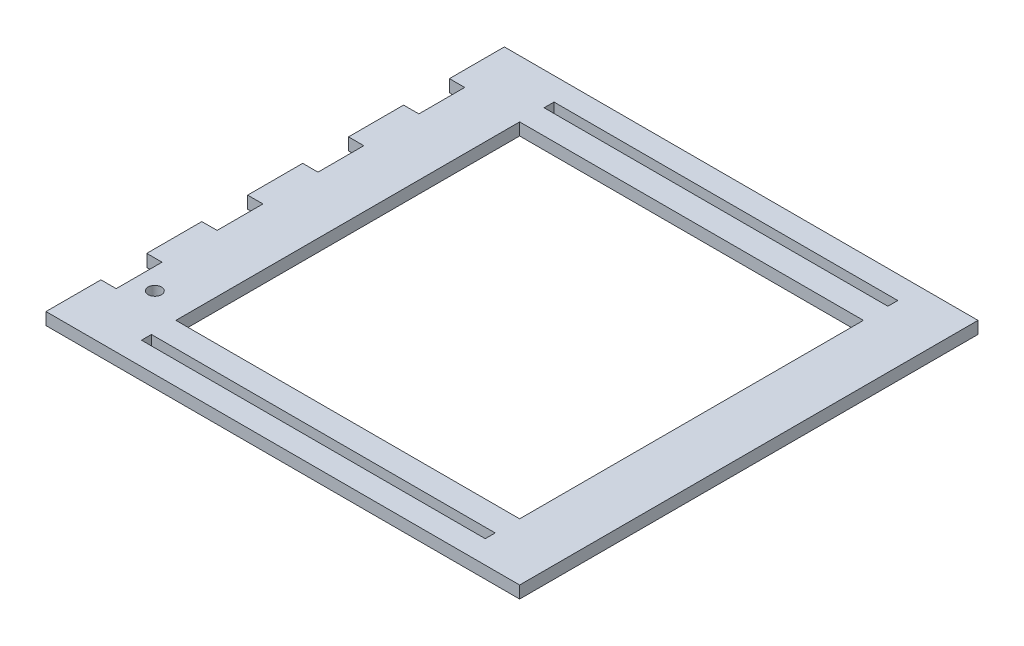
ISO-10303-21;
HEADER;
FILE_DESCRIPTION(('STEP AP214'),'2;1');
FILE_NAME('part.step','',(''),(''),'','','');
FILE_SCHEMA(('AUTOMOTIVE_DESIGN { 1 0 10303 214 1 1 1 1 }'));
ENDSEC;
DATA;
#1=APPLICATION_CONTEXT('core data for automotive mechanical design processes');
#2=APPLICATION_PROTOCOL_DEFINITION('international standard','automotive_design',2000,#1);
#3=PRODUCT_CONTEXT('',#1,'mechanical');
#4=PRODUCT('Part','Part','',(#3));
#5=PRODUCT_RELATED_PRODUCT_CATEGORY('part','',(#4));
#6=PRODUCT_DEFINITION_FORMATION('','',#4);
#7=PRODUCT_DEFINITION_CONTEXT('part definition',#1,'design');
#8=PRODUCT_DEFINITION('design','',#6,#7);
#9=PRODUCT_DEFINITION_SHAPE('','',#8);
#10=(LENGTH_UNIT() NAMED_UNIT(*) SI_UNIT(.MILLI.,.METRE.));
#11=(NAMED_UNIT(*) PLANE_ANGLE_UNIT() SI_UNIT($,.RADIAN.));
#12=(NAMED_UNIT(*) SI_UNIT($,.STERADIAN.) SOLID_ANGLE_UNIT());
#13=UNCERTAINTY_MEASURE_WITH_UNIT(LENGTH_MEASURE(1.E-05),#10,'distance_accuracy_value','');
#14=(GEOMETRIC_REPRESENTATION_CONTEXT(3) GLOBAL_UNCERTAINTY_ASSIGNED_CONTEXT((#13)) GLOBAL_UNIT_ASSIGNED_CONTEXT((#10,
#11,#12)) REPRESENTATION_CONTEXT('',''));
#15=CARTESIAN_POINT('',(0.,0.,0.));
#16=DIRECTION('',(0.,0.,1.));
#17=DIRECTION('',(1.,0.,0.));
#18=AXIS2_PLACEMENT_3D('',#15,#16,#17);
#19=CARTESIAN_POINT('',(-381.,4.064,-76.2));
#20=DIRECTION('',(0.,0.,1.));
#21=DIRECTION('',(1.,0.,0.));
#22=AXIS2_PLACEMENT_3D('',#19,#20,#21);
#23=PLANE('',#22);
#24=DIRECTION('',(-1.,0.,0.));
#25=VECTOR('',#24,1.);
#26=CARTESIAN_POINT('',(76.2,4.064,-76.1999999999999));
#27=LINE('',#26,#25);
#28=CARTESIAN_POINT('',(-228.6,4.064,-76.2));
#29=VERTEX_POINT('',#28);
#30=CARTESIAN_POINT('',(-386.08,4.064,-76.2));
#31=VERTEX_POINT('',#30);
#32=EDGE_CURVE('E251',#29,#31,#27,.T.);
#33=ORIENTED_EDGE('',*,*,#32,.F.);
#34=DIRECTION('',(0.,-1.,0.));
#35=VECTOR('',#34,1.);
#36=CARTESIAN_POINT('',(-228.6,4.064,-76.2));
#37=LINE('',#36,#35);
#38=CARTESIAN_POINT('',(-228.6,0.,-76.2));
#39=VERTEX_POINT('',#38);
#40=EDGE_CURVE('E239',#29,#39,#37,.T.);
#41=ORIENTED_EDGE('',*,*,#40,.T.);
#42=DIRECTION('',(-1.,0.,0.));
#43=VECTOR('',#42,1.);
#44=CARTESIAN_POINT('',(-381.,0.,-76.2));
#45=LINE('',#44,#43);
#46=CARTESIAN_POINT('',(-386.08,0.,-76.2));
#47=VERTEX_POINT('',#46);
#48=EDGE_CURVE('E298',#39,#47,#45,.T.);
#49=ORIENTED_EDGE('',*,*,#48,.T.);
#50=DIRECTION('',(0.,-1.,0.));
#51=VECTOR('',#50,1.);
#52=CARTESIAN_POINT('',(-386.08,4.064,-76.2));
#53=LINE('',#52,#51);
#54=EDGE_CURVE('E41',#31,#47,#53,.T.);
#55=ORIENTED_EDGE('',*,*,#54,.F.);
#56=EDGE_LOOP('',(#33,#41,#49,#55));
#57=FACE_BOUND('',#56,.T.);
#58=ADVANCED_FACE('F34',(#57),#23,.F.);
#59=CARTESIAN_POINT('',(-386.08,4.064,-76.2));
#60=DIRECTION('',(1.,0.,0.));
#61=DIRECTION('',(0.,0.,-1.));
#62=AXIS2_PLACEMENT_3D('',#59,#60,#61);
#63=PLANE('',#62);
#64=DIRECTION('',(0.,0.,1.));
#65=VECTOR('',#64,1.);
#66=CARTESIAN_POINT('',(-386.08,0.,-76.2));
#67=LINE('',#66,#65);
#68=CARTESIAN_POINT('',(-386.08,0.,-57.9375000000001));
#69=VERTEX_POINT('',#68);
#70=EDGE_CURVE('E300',#47,#69,#67,.T.);
#71=ORIENTED_EDGE('',*,*,#70,.T.);
#72=DIRECTION('',(0.,-1.,0.));
#73=VECTOR('',#72,1.);
#74=CARTESIAN_POINT('',(-386.08,4.064,-57.9375000000001));
#75=LINE('',#74,#73);
#76=CARTESIAN_POINT('',(-386.08,4.064,-57.9375000000001));
#77=VERTEX_POINT('',#76);
#78=EDGE_CURVE('E385',#77,#69,#75,.T.);
#79=ORIENTED_EDGE('',*,*,#78,.F.);
#80=DIRECTION('',(0.,0.,1.));
#81=VECTOR('',#80,1.);
#82=CARTESIAN_POINT('',(-386.08,4.064,-76.2));
#83=LINE('',#82,#81);
#84=EDGE_CURVE('E258',#31,#77,#83,.T.);
#85=ORIENTED_EDGE('',*,*,#84,.F.);
#86=ORIENTED_EDGE('',*,*,#54,.T.);
#87=EDGE_LOOP('',(#71,#79,#85,#86));
#88=FACE_BOUND('',#87,.T.);
#89=ADVANCED_FACE('F389',(#88),#63,.F.);
#90=CARTESIAN_POINT('',(-386.08,4.064,-57.9375000000001));
#91=DIRECTION('',(0.,0.,-1.));
#92=DIRECTION('',(-1.,0.,0.));
#93=AXIS2_PLACEMENT_3D('',#90,#91,#92);
#94=PLANE('',#93);
#95=DIRECTION('',(1.,0.,0.));
#96=VECTOR('',#95,1.);
#97=CARTESIAN_POINT('',(-386.08,0.,-57.9375000000001));
#98=LINE('',#97,#96);
#99=CARTESIAN_POINT('',(-381.,0.,-57.9375000000001));
#100=VERTEX_POINT('',#99);
#101=EDGE_CURVE('E303',#69,#100,#98,.T.);
#102=ORIENTED_EDGE('',*,*,#101,.T.);
#103=DIRECTION('',(0.,-1.,0.));
#104=VECTOR('',#103,1.);
#105=CARTESIAN_POINT('',(-381.,4.064,-57.9375000000001));
#106=LINE('',#105,#104);
#107=CARTESIAN_POINT('',(-381.,4.064,-57.9375000000001));
#108=VERTEX_POINT('',#107);
#109=EDGE_CURVE('E382',#108,#100,#106,.T.);
#110=ORIENTED_EDGE('',*,*,#109,.F.);
#111=DIRECTION('',(1.,0.,0.));
#112=VECTOR('',#111,1.);
#113=CARTESIAN_POINT('',(-386.08,4.064,-57.9375000000001));
#114=LINE('',#113,#112);
#115=EDGE_CURVE('E260',#77,#108,#114,.T.);
#116=ORIENTED_EDGE('',*,*,#115,.F.);
#117=ORIENTED_EDGE('',*,*,#78,.T.);
#118=EDGE_LOOP('',(#102,#110,#116,#117));
#119=FACE_BOUND('',#118,.T.);
#120=ADVANCED_FACE('F398',(#119),#94,.F.);
#121=CARTESIAN_POINT('',(-381.,4.064,-57.9375000000001));
#122=DIRECTION('',(1.,0.,0.));
#123=DIRECTION('',(0.,0.,-1.));
#124=AXIS2_PLACEMENT_3D('',#121,#122,#123);
#125=PLANE('',#124);
#126=DIRECTION('',(0.,0.,1.));
#127=VECTOR('',#126,1.);
#128=CARTESIAN_POINT('',(-381.,0.,-57.9375000000001));
#129=LINE('',#128,#127);
#130=CARTESIAN_POINT('',(-381.,0.,-42.6975000000001));
#131=VERTEX_POINT('',#130);
#132=EDGE_CURVE('E305',#100,#131,#129,.T.);
#133=ORIENTED_EDGE('',*,*,#132,.T.);
#134=DIRECTION('',(0.,-1.,0.));
#135=VECTOR('',#134,1.);
#136=CARTESIAN_POINT('',(-381.,4.064,-42.6975000000001));
#137=LINE('',#136,#135);
#138=CARTESIAN_POINT('',(-381.,4.064,-42.6975000000001));
#139=VERTEX_POINT('',#138);
#140=EDGE_CURVE('E379',#139,#131,#137,.T.);
#141=ORIENTED_EDGE('',*,*,#140,.F.);
#142=DIRECTION('',(0.,0.,1.));
#143=VECTOR('',#142,1.);
#144=CARTESIAN_POINT('',(-381.,4.064,-57.9375000000001));
#145=LINE('',#144,#143);
#146=EDGE_CURVE('E267',#108,#139,#145,.T.);
#147=ORIENTED_EDGE('',*,*,#146,.F.);
#148=ORIENTED_EDGE('',*,*,#109,.T.);
#149=EDGE_LOOP('',(#133,#141,#147,#148));
#150=FACE_BOUND('',#149,.T.);
#151=ADVANCED_FACE('F402',(#150),#125,.F.);
#152=CARTESIAN_POINT('',(-381.,4.064,-42.6975000000001));
#153=DIRECTION('',(0.,0.,1.));
#154=DIRECTION('',(1.,0.,0.));
#155=AXIS2_PLACEMENT_3D('',#152,#153,#154);
#156=PLANE('',#155);
#157=DIRECTION('',(-1.,0.,0.));
#158=VECTOR('',#157,1.);
#159=CARTESIAN_POINT('',(-381.,0.,-42.6975000000001));
#160=LINE('',#159,#158);
#161=CARTESIAN_POINT('',(-386.08,0.,-42.6975000000001));
#162=VERTEX_POINT('',#161);
#163=EDGE_CURVE('E307',#131,#162,#160,.T.);
#164=ORIENTED_EDGE('',*,*,#163,.T.);
#165=DIRECTION('',(0.,-1.,0.));
#166=VECTOR('',#165,1.);
#167=CARTESIAN_POINT('',(-386.08,4.064,-42.6975000000001));
#168=LINE('',#167,#166);
#169=CARTESIAN_POINT('',(-386.08,4.064,-42.6975000000001));
#170=VERTEX_POINT('',#169);
#171=EDGE_CURVE('E376',#170,#162,#168,.T.);
#172=ORIENTED_EDGE('',*,*,#171,.F.);
#173=DIRECTION('',(-1.,0.,0.));
#174=VECTOR('',#173,1.);
#175=CARTESIAN_POINT('',(-381.,4.064,-42.6975000000001));
#176=LINE('',#175,#174);
#177=EDGE_CURVE('E269',#139,#170,#176,.T.);
#178=ORIENTED_EDGE('',*,*,#177,.F.);
#179=ORIENTED_EDGE('',*,*,#140,.T.);
#180=EDGE_LOOP('',(#164,#172,#178,#179));
#181=FACE_BOUND('',#180,.T.);
#182=ADVANCED_FACE('F409',(#181),#156,.F.);
#183=CARTESIAN_POINT('',(-386.08,4.064,-42.6975000000001));
#184=DIRECTION('',(1.,0.,0.));
#185=DIRECTION('',(0.,0.,-1.));
#186=AXIS2_PLACEMENT_3D('',#183,#184,#185);
#187=PLANE('',#186);
#188=DIRECTION('',(0.,0.,1.));
#189=VECTOR('',#188,1.);
#190=CARTESIAN_POINT('',(-386.08,0.,-42.6975000000001));
#191=LINE('',#190,#189);
#192=CARTESIAN_POINT('',(-386.08,0.,-24.3925000000001));
#193=VERTEX_POINT('',#192);
#194=EDGE_CURVE('E309',#162,#193,#191,.T.);
#195=ORIENTED_EDGE('',*,*,#194,.T.);
#196=DIRECTION('',(0.,-1.,0.));
#197=VECTOR('',#196,1.);
#198=CARTESIAN_POINT('',(-386.08,4.064,-24.3925000000001));
#199=LINE('',#198,#197);
#200=CARTESIAN_POINT('',(-386.08,4.064,-24.3925000000001));
#201=VERTEX_POINT('',#200);
#202=EDGE_CURVE('E373',#201,#193,#199,.T.);
#203=ORIENTED_EDGE('',*,*,#202,.F.);
#204=DIRECTION('',(0.,0.,1.));
#205=VECTOR('',#204,1.);
#206=CARTESIAN_POINT('',(-386.08,4.064,-42.6975000000001));
#207=LINE('',#206,#205);
#208=EDGE_CURVE('E271',#170,#201,#207,.T.);
#209=ORIENTED_EDGE('',*,*,#208,.F.);
#210=ORIENTED_EDGE('',*,*,#171,.T.);
#211=EDGE_LOOP('',(#195,#203,#209,#210));
#212=FACE_BOUND('',#211,.T.);
#213=ADVANCED_FACE('F412',(#212),#187,.F.);
#214=CARTESIAN_POINT('',(-386.08,4.064,-24.3925000000001));
#215=DIRECTION('',(0.,0.,-1.));
#216=DIRECTION('',(-1.,0.,0.));
#217=AXIS2_PLACEMENT_3D('',#214,#215,#216);
#218=PLANE('',#217);
#219=DIRECTION('',(1.,0.,0.));
#220=VECTOR('',#219,1.);
#221=CARTESIAN_POINT('',(-386.08,0.,-24.3925000000001));
#222=LINE('',#221,#220);
#223=CARTESIAN_POINT('',(-381.,0.,-24.3925000000001));
#224=VERTEX_POINT('',#223);
#225=EDGE_CURVE('E311',#193,#224,#222,.T.);
#226=ORIENTED_EDGE('',*,*,#225,.T.);
#227=DIRECTION('',(0.,-1.,0.));
#228=VECTOR('',#227,1.);
#229=CARTESIAN_POINT('',(-381.,4.064,-24.3925000000001));
#230=LINE('',#229,#228);
#231=CARTESIAN_POINT('',(-381.,4.064,-24.3925000000001));
#232=VERTEX_POINT('',#231);
#233=EDGE_CURVE('E370',#232,#224,#230,.T.);
#234=ORIENTED_EDGE('',*,*,#233,.F.);
#235=DIRECTION('',(1.,0.,0.));
#236=VECTOR('',#235,1.);
#237=CARTESIAN_POINT('',(-386.08,4.064,-24.3925000000001));
#238=LINE('',#237,#236);
#239=EDGE_CURVE('E273',#201,#232,#238,.T.);
#240=ORIENTED_EDGE('',*,*,#239,.F.);
#241=ORIENTED_EDGE('',*,*,#202,.T.);
#242=EDGE_LOOP('',(#226,#234,#240,#241));
#243=FACE_BOUND('',#242,.T.);
#244=ADVANCED_FACE('F417',(#243),#218,.F.);
#245=CARTESIAN_POINT('',(-381.,4.064,-24.3925000000001));
#246=DIRECTION('',(1.,0.,0.));
#247=DIRECTION('',(0.,0.,-1.));
#248=AXIS2_PLACEMENT_3D('',#245,#246,#247);
#249=PLANE('',#248);
#250=DIRECTION('',(0.,0.,1.));
#251=VECTOR('',#250,1.);
#252=CARTESIAN_POINT('',(-381.,0.,-24.3925000000001));
#253=LINE('',#252,#251);
#254=CARTESIAN_POINT('',(-381.,0.,-9.15250000000007));
#255=VERTEX_POINT('',#254);
#256=EDGE_CURVE('E313',#224,#255,#253,.T.);
#257=ORIENTED_EDGE('',*,*,#256,.T.);
#258=DIRECTION('',(0.,-1.,0.));
#259=VECTOR('',#258,1.);
#260=CARTESIAN_POINT('',(-381.,4.064,-9.15250000000007));
#261=LINE('',#260,#259);
#262=CARTESIAN_POINT('',(-381.,4.064,-9.15250000000007));
#263=VERTEX_POINT('',#262);
#264=EDGE_CURVE('E367',#263,#255,#261,.T.);
#265=ORIENTED_EDGE('',*,*,#264,.F.);
#266=DIRECTION('',(0.,0.,1.));
#267=VECTOR('',#266,1.);
#268=CARTESIAN_POINT('',(-381.,4.064,-24.3925000000001));
#269=LINE('',#268,#267);
#270=EDGE_CURVE('E275',#232,#263,#269,.T.);
#271=ORIENTED_EDGE('',*,*,#270,.F.);
#272=ORIENTED_EDGE('',*,*,#233,.T.);
#273=EDGE_LOOP('',(#257,#265,#271,#272));
#274=FACE_BOUND('',#273,.T.);
#275=ADVANCED_FACE('F423',(#274),#249,.F.);
#276=CARTESIAN_POINT('',(-381.,4.064,-9.15250000000007));
#277=DIRECTION('',(0.,0.,1.));
#278=DIRECTION('',(1.,0.,0.));
#279=AXIS2_PLACEMENT_3D('',#276,#277,#278);
#280=PLANE('',#279);
#281=DIRECTION('',(-1.,0.,0.));
#282=VECTOR('',#281,1.);
#283=CARTESIAN_POINT('',(-381.,0.,-9.15250000000007));
#284=LINE('',#283,#282);
#285=CARTESIAN_POINT('',(-386.08,0.,-9.15250000000007));
#286=VERTEX_POINT('',#285);
#287=EDGE_CURVE('E315',#255,#286,#284,.T.);
#288=ORIENTED_EDGE('',*,*,#287,.T.);
#289=DIRECTION('',(0.,-1.,0.));
#290=VECTOR('',#289,1.);
#291=CARTESIAN_POINT('',(-386.08,4.064,-9.15250000000007));
#292=LINE('',#291,#290);
#293=CARTESIAN_POINT('',(-386.08,4.064,-9.15250000000007));
#294=VERTEX_POINT('',#293);
#295=EDGE_CURVE('E364',#294,#286,#292,.T.);
#296=ORIENTED_EDGE('',*,*,#295,.F.);
#297=DIRECTION('',(-1.,0.,0.));
#298=VECTOR('',#297,1.);
#299=CARTESIAN_POINT('',(-381.,4.064,-9.15250000000007));
#300=LINE('',#299,#298);
#301=EDGE_CURVE('E277',#263,#294,#300,.T.);
#302=ORIENTED_EDGE('',*,*,#301,.F.);
#303=ORIENTED_EDGE('',*,*,#264,.T.);
#304=EDGE_LOOP('',(#288,#296,#302,#303));
#305=FACE_BOUND('',#304,.T.);
#306=ADVANCED_FACE('F427',(#305),#280,.F.);
#307=CARTESIAN_POINT('',(-386.08,4.064,-9.15250000000007));
#308=DIRECTION('',(1.,0.,0.));
#309=DIRECTION('',(0.,0.,-1.));
#310=AXIS2_PLACEMENT_3D('',#307,#308,#309);
#311=PLANE('',#310);
#312=DIRECTION('',(0.,0.,1.));
#313=VECTOR('',#312,1.);
#314=CARTESIAN_POINT('',(-386.08,0.,-9.15250000000007));
#315=LINE('',#314,#313);
#316=CARTESIAN_POINT('',(-386.08,0.,9.15249999999993));
#317=VERTEX_POINT('',#316);
#318=EDGE_CURVE('E317',#286,#317,#315,.T.);
#319=ORIENTED_EDGE('',*,*,#318,.T.);
#320=DIRECTION('',(0.,-1.,0.));
#321=VECTOR('',#320,1.);
#322=CARTESIAN_POINT('',(-386.08,4.064,9.15249999999993));
#323=LINE('',#322,#321);
#324=CARTESIAN_POINT('',(-386.08,4.064,9.15249999999993));
#325=VERTEX_POINT('',#324);
#326=EDGE_CURVE('E361',#325,#317,#323,.T.);
#327=ORIENTED_EDGE('',*,*,#326,.F.);
#328=DIRECTION('',(0.,0.,1.));
#329=VECTOR('',#328,1.);
#330=CARTESIAN_POINT('',(-386.08,4.064,-9.15250000000007));
#331=LINE('',#330,#329);
#332=EDGE_CURVE('E279',#294,#325,#331,.T.);
#333=ORIENTED_EDGE('',*,*,#332,.F.);
#334=ORIENTED_EDGE('',*,*,#295,.T.);
#335=EDGE_LOOP('',(#319,#327,#333,#334));
#336=FACE_BOUND('',#335,.T.);
#337=ADVANCED_FACE('F432',(#336),#311,.F.);
#338=CARTESIAN_POINT('',(-386.08,4.064,9.15249999999993));
#339=DIRECTION('',(0.,0.,-1.));
#340=DIRECTION('',(-1.,0.,0.));
#341=AXIS2_PLACEMENT_3D('',#338,#339,#340);
#342=PLANE('',#341);
#343=DIRECTION('',(1.,0.,0.));
#344=VECTOR('',#343,1.);
#345=CARTESIAN_POINT('',(-386.08,0.,9.15249999999993));
#346=LINE('',#345,#344);
#347=CARTESIAN_POINT('',(-381.,0.,9.15249999999993));
#348=VERTEX_POINT('',#347);
#349=EDGE_CURVE('E319',#317,#348,#346,.T.);
#350=ORIENTED_EDGE('',*,*,#349,.T.);
#351=DIRECTION('',(0.,-1.,0.));
#352=VECTOR('',#351,1.);
#353=CARTESIAN_POINT('',(-381.,4.064,9.15249999999993));
#354=LINE('',#353,#352);
#355=CARTESIAN_POINT('',(-381.,4.064,9.15249999999993));
#356=VERTEX_POINT('',#355);
#357=EDGE_CURVE('E358',#356,#348,#354,.T.);
#358=ORIENTED_EDGE('',*,*,#357,.F.);
#359=DIRECTION('',(1.,0.,0.));
#360=VECTOR('',#359,1.);
#361=CARTESIAN_POINT('',(-386.08,4.064,9.15249999999993));
#362=LINE('',#361,#360);
#363=EDGE_CURVE('E281',#325,#356,#362,.T.);
#364=ORIENTED_EDGE('',*,*,#363,.F.);
#365=ORIENTED_EDGE('',*,*,#326,.T.);
#366=EDGE_LOOP('',(#350,#358,#364,#365));
#367=FACE_BOUND('',#366,.T.);
#368=ADVANCED_FACE('F438',(#367),#342,.F.);
#369=CARTESIAN_POINT('',(-381.,4.064,9.15249999999993));
#370=DIRECTION('',(1.,0.,0.));
#371=DIRECTION('',(0.,0.,-1.));
#372=AXIS2_PLACEMENT_3D('',#369,#370,#371);
#373=PLANE('',#372);
#374=DIRECTION('',(0.,0.,1.));
#375=VECTOR('',#374,1.);
#376=CARTESIAN_POINT('',(-381.,0.,9.15249999999993));
#377=LINE('',#376,#375);
#378=CARTESIAN_POINT('',(-381.,0.,24.3924999999999));
#379=VERTEX_POINT('',#378);
#380=EDGE_CURVE('E321',#348,#379,#377,.T.);
#381=ORIENTED_EDGE('',*,*,#380,.T.);
#382=DIRECTION('',(0.,-1.,0.));
#383=VECTOR('',#382,1.);
#384=CARTESIAN_POINT('',(-381.,4.064,24.3924999999999));
#385=LINE('',#384,#383);
#386=CARTESIAN_POINT('',(-381.,4.064,24.3924999999999));
#387=VERTEX_POINT('',#386);
#388=EDGE_CURVE('E355',#387,#379,#385,.T.);
#389=ORIENTED_EDGE('',*,*,#388,.F.);
#390=DIRECTION('',(0.,0.,1.));
#391=VECTOR('',#390,1.);
#392=CARTESIAN_POINT('',(-381.,4.064,9.15249999999993));
#393=LINE('',#392,#391);
#394=EDGE_CURVE('E283',#356,#387,#393,.T.);
#395=ORIENTED_EDGE('',*,*,#394,.F.);
#396=ORIENTED_EDGE('',*,*,#357,.T.);
#397=EDGE_LOOP('',(#381,#389,#395,#396));
#398=FACE_BOUND('',#397,.T.);
#399=ADVANCED_FACE('F442',(#398),#373,.F.);
#400=CARTESIAN_POINT('',(-381.,4.064,24.3924999999999));
#401=DIRECTION('',(0.,0.,1.));
#402=DIRECTION('',(1.,0.,0.));
#403=AXIS2_PLACEMENT_3D('',#400,#401,#402);
#404=PLANE('',#403);
#405=DIRECTION('',(-1.,0.,0.));
#406=VECTOR('',#405,1.);
#407=CARTESIAN_POINT('',(-381.,0.,24.3924999999999));
#408=LINE('',#407,#406);
#409=CARTESIAN_POINT('',(-386.08,0.,24.3924999999999));
#410=VERTEX_POINT('',#409);
#411=EDGE_CURVE('E323',#379,#410,#408,.T.);
#412=ORIENTED_EDGE('',*,*,#411,.T.);
#413=DIRECTION('',(0.,-1.,0.));
#414=VECTOR('',#413,1.);
#415=CARTESIAN_POINT('',(-386.08,4.064,24.3924999999999));
#416=LINE('',#415,#414);
#417=CARTESIAN_POINT('',(-386.08,4.064,24.3924999999999));
#418=VERTEX_POINT('',#417);
#419=EDGE_CURVE('E352',#418,#410,#416,.T.);
#420=ORIENTED_EDGE('',*,*,#419,.F.);
#421=DIRECTION('',(-1.,0.,0.));
#422=VECTOR('',#421,1.);
#423=CARTESIAN_POINT('',(-381.,4.064,24.3924999999999));
#424=LINE('',#423,#422);
#425=EDGE_CURVE('E285',#387,#418,#424,.T.);
#426=ORIENTED_EDGE('',*,*,#425,.F.);
#427=ORIENTED_EDGE('',*,*,#388,.T.);
#428=EDGE_LOOP('',(#412,#420,#426,#427));
#429=FACE_BOUND('',#428,.T.);
#430=ADVANCED_FACE('F447',(#429),#404,.F.);
#431=CARTESIAN_POINT('',(-386.08,4.064,24.3924999999999));
#432=DIRECTION('',(1.,0.,0.));
#433=DIRECTION('',(0.,0.,-1.));
#434=AXIS2_PLACEMENT_3D('',#431,#432,#433);
#435=PLANE('',#434);
#436=DIRECTION('',(0.,0.,1.));
#437=VECTOR('',#436,1.);
#438=CARTESIAN_POINT('',(-386.08,0.,24.3924999999999));
#439=LINE('',#438,#437);
#440=CARTESIAN_POINT('',(-386.08,0.,42.6974999999999));
#441=VERTEX_POINT('',#440);
#442=EDGE_CURVE('E325',#410,#441,#439,.T.);
#443=ORIENTED_EDGE('',*,*,#442,.T.);
#444=DIRECTION('',(0.,-1.,0.));
#445=VECTOR('',#444,1.);
#446=CARTESIAN_POINT('',(-386.08,4.064,42.6974999999999));
#447=LINE('',#446,#445);
#448=CARTESIAN_POINT('',(-386.08,4.064,42.6974999999999));
#449=VERTEX_POINT('',#448);
#450=EDGE_CURVE('E349',#449,#441,#447,.T.);
#451=ORIENTED_EDGE('',*,*,#450,.F.);
#452=DIRECTION('',(0.,0.,1.));
#453=VECTOR('',#452,1.);
#454=CARTESIAN_POINT('',(-386.08,4.064,24.3924999999999));
#455=LINE('',#454,#453);
#456=EDGE_CURVE('E287',#418,#449,#455,.T.);
#457=ORIENTED_EDGE('',*,*,#456,.F.);
#458=ORIENTED_EDGE('',*,*,#419,.T.);
#459=EDGE_LOOP('',(#443,#451,#457,#458));
#460=FACE_BOUND('',#459,.T.);
#461=ADVANCED_FACE('F453',(#460),#435,.F.);
#462=CARTESIAN_POINT('',(-386.08,4.064,42.6974999999999));
#463=DIRECTION('',(0.,0.,-1.));
#464=DIRECTION('',(-1.,0.,0.));
#465=AXIS2_PLACEMENT_3D('',#462,#463,#464);
#466=PLANE('',#465);
#467=DIRECTION('',(1.,0.,0.));
#468=VECTOR('',#467,1.);
#469=CARTESIAN_POINT('',(-386.08,0.,42.6974999999999));
#470=LINE('',#469,#468);
#471=CARTESIAN_POINT('',(-381.,0.,42.6974999999999));
#472=VERTEX_POINT('',#471);
#473=EDGE_CURVE('E327',#441,#472,#470,.T.);
#474=ORIENTED_EDGE('',*,*,#473,.T.);
#475=DIRECTION('',(0.,-1.,0.));
#476=VECTOR('',#475,1.);
#477=CARTESIAN_POINT('',(-381.,4.064,42.6974999999999));
#478=LINE('',#477,#476);
#479=CARTESIAN_POINT('',(-381.,4.064,42.6974999999999));
#480=VERTEX_POINT('',#479);
#481=EDGE_CURVE('E346',#480,#472,#478,.T.);
#482=ORIENTED_EDGE('',*,*,#481,.F.);
#483=DIRECTION('',(1.,0.,0.));
#484=VECTOR('',#483,1.);
#485=CARTESIAN_POINT('',(-386.08,4.064,42.6974999999999));
#486=LINE('',#485,#484);
#487=EDGE_CURVE('E289',#449,#480,#486,.T.);
#488=ORIENTED_EDGE('',*,*,#487,.F.);
#489=ORIENTED_EDGE('',*,*,#450,.T.);
#490=EDGE_LOOP('',(#474,#482,#488,#489));
#491=FACE_BOUND('',#490,.T.);
#492=ADVANCED_FACE('F457',(#491),#466,.F.);
#493=CARTESIAN_POINT('',(-381.,4.064,42.6974999999999));
#494=DIRECTION('',(1.,0.,0.));
#495=DIRECTION('',(0.,0.,-1.));
#496=AXIS2_PLACEMENT_3D('',#493,#494,#495);
#497=PLANE('',#496);
#498=DIRECTION('',(0.,0.,1.));
#499=VECTOR('',#498,1.);
#500=CARTESIAN_POINT('',(-381.,0.,42.6974999999999));
#501=LINE('',#500,#499);
#502=CARTESIAN_POINT('',(-381.,0.,57.9374999999999));
#503=VERTEX_POINT('',#502);
#504=EDGE_CURVE('E329',#472,#503,#501,.T.);
#505=ORIENTED_EDGE('',*,*,#504,.T.);
#506=DIRECTION('',(0.,-1.,0.));
#507=VECTOR('',#506,1.);
#508=CARTESIAN_POINT('',(-381.,4.064,57.9374999999999));
#509=LINE('',#508,#507);
#510=CARTESIAN_POINT('',(-381.,4.064,57.9374999999999));
#511=VERTEX_POINT('',#510);
#512=EDGE_CURVE('E343',#511,#503,#509,.T.);
#513=ORIENTED_EDGE('',*,*,#512,.F.);
#514=DIRECTION('',(0.,0.,1.));
#515=VECTOR('',#514,1.);
#516=CARTESIAN_POINT('',(-381.,4.064,42.6974999999999));
#517=LINE('',#516,#515);
#518=EDGE_CURVE('E291',#480,#511,#517,.T.);
#519=ORIENTED_EDGE('',*,*,#518,.F.);
#520=ORIENTED_EDGE('',*,*,#481,.T.);
#521=EDGE_LOOP('',(#505,#513,#519,#520));
#522=FACE_BOUND('',#521,.T.);
#523=ADVANCED_FACE('F462',(#522),#497,.F.);
#524=CARTESIAN_POINT('',(-381.,4.064,57.9374999999999));
#525=DIRECTION('',(0.,0.,1.));
#526=DIRECTION('',(1.,0.,0.));
#527=AXIS2_PLACEMENT_3D('',#524,#525,#526);
#528=PLANE('',#527);
#529=DIRECTION('',(-1.,0.,0.));
#530=VECTOR('',#529,1.);
#531=CARTESIAN_POINT('',(-381.,0.,57.9374999999999));
#532=LINE('',#531,#530);
#533=CARTESIAN_POINT('',(-386.08,0.,57.9374999999999));
#534=VERTEX_POINT('',#533);
#535=EDGE_CURVE('E331',#503,#534,#532,.T.);
#536=ORIENTED_EDGE('',*,*,#535,.T.);
#537=DIRECTION('',(0.,-1.,0.));
#538=VECTOR('',#537,1.);
#539=CARTESIAN_POINT('',(-386.08,4.064,57.9374999999999));
#540=LINE('',#539,#538);
#541=CARTESIAN_POINT('',(-386.08,4.064,57.9374999999999));
#542=VERTEX_POINT('',#541);
#543=EDGE_CURVE('E340',#542,#534,#540,.T.);
#544=ORIENTED_EDGE('',*,*,#543,.F.);
#545=DIRECTION('',(-1.,0.,0.));
#546=VECTOR('',#545,1.);
#547=CARTESIAN_POINT('',(-381.,4.064,57.9374999999999));
#548=LINE('',#547,#546);
#549=EDGE_CURVE('E293',#511,#542,#548,.T.);
#550=ORIENTED_EDGE('',*,*,#549,.F.);
#551=ORIENTED_EDGE('',*,*,#512,.T.);
#552=EDGE_LOOP('',(#536,#544,#550,#551));
#553=FACE_BOUND('',#552,.T.);
#554=ADVANCED_FACE('F468',(#553),#528,.F.);
#555=CARTESIAN_POINT('',(-386.08,4.064,57.9374999999999));
#556=DIRECTION('',(1.,0.,0.));
#557=DIRECTION('',(0.,0.,-1.));
#558=AXIS2_PLACEMENT_3D('',#555,#556,#557);
#559=PLANE('',#558);
#560=DIRECTION('',(0.,0.,1.));
#561=VECTOR('',#560,1.);
#562=CARTESIAN_POINT('',(-386.08,0.,57.9374999999999));
#563=LINE('',#562,#561);
#564=CARTESIAN_POINT('',(-386.08,0.,76.2));
#565=VERTEX_POINT('',#564);
#566=EDGE_CURVE('E333',#534,#565,#563,.T.);
#567=ORIENTED_EDGE('',*,*,#566,.T.);
#568=DIRECTION('',(0.,-1.,0.));
#569=VECTOR('',#568,1.);
#570=CARTESIAN_POINT('',(-386.08,4.064,76.2));
#571=LINE('',#570,#569);
#572=CARTESIAN_POINT('',(-386.08,4.064,76.2));
#573=VERTEX_POINT('',#572);
#574=EDGE_CURVE('E297',#573,#565,#571,.T.);
#575=ORIENTED_EDGE('',*,*,#574,.F.);
#576=DIRECTION('',(0.,0.,1.));
#577=VECTOR('',#576,1.);
#578=CARTESIAN_POINT('',(-386.08,4.064,57.9374999999999));
#579=LINE('',#578,#577);
#580=EDGE_CURVE('E295',#542,#573,#579,.T.);
#581=ORIENTED_EDGE('',*,*,#580,.F.);
#582=ORIENTED_EDGE('',*,*,#543,.T.);
#583=EDGE_LOOP('',(#567,#575,#581,#582));
#584=FACE_BOUND('',#583,.T.);
#585=ADVANCED_FACE('F472',(#584),#559,.F.);
#586=CARTESIAN_POINT('',(-76.2000000000001,4.064,76.2));
#587=DIRECTION('',(0.,0.,-1.));
#588=DIRECTION('',(-1.,0.,0.));
#589=AXIS2_PLACEMENT_3D('',#586,#587,#588);
#590=PLANE('',#589);
#591=DIRECTION('',(1.,0.,0.));
#592=VECTOR('',#591,1.);
#593=CARTESIAN_POINT('',(-76.2000000000001,0.,76.2));
#594=LINE('',#593,#592);
#595=CARTESIAN_POINT('',(-228.6,0.,76.2));
#596=VERTEX_POINT('',#595);
#597=EDGE_CURVE('E262',#565,#596,#594,.T.);
#598=ORIENTED_EDGE('',*,*,#597,.T.);
#599=DIRECTION('',(0.,-1.,0.));
#600=VECTOR('',#599,1.);
#601=CARTESIAN_POINT('',(-228.6,4.064,76.2));
#602=LINE('',#601,#600);
#603=CARTESIAN_POINT('',(-228.6,4.064,76.2));
#604=VERTEX_POINT('',#603);
#605=EDGE_CURVE('E48',#604,#596,#602,.T.);
#606=ORIENTED_EDGE('',*,*,#605,.F.);
#607=DIRECTION('',(1.,0.,0.));
#608=VECTOR('',#607,1.);
#609=CARTESIAN_POINT('',(76.1999999999999,4.064,76.2));
#610=LINE('',#609,#608);
#611=EDGE_CURVE('E254',#573,#604,#610,.T.);
#612=ORIENTED_EDGE('',*,*,#611,.F.);
#613=ORIENTED_EDGE('',*,*,#574,.T.);
#614=EDGE_LOOP('',(#598,#606,#612,#613));
#615=FACE_BOUND('',#614,.T.);
#616=ADVANCED_FACE('F474',(#615),#590,.F.);
#617=CARTESIAN_POINT('',(0.,4.064,0.));
#618=DIRECTION('',(0.,1.,0.));
#619=DIRECTION('',(0.,0.,1.));
#620=AXIS2_PLACEMENT_3D('',#617,#618,#619);
#621=PLANE('',#620);
#622=DIRECTION('',(0.,0.,-1.));
#623=VECTOR('',#622,1.);
#624=CARTESIAN_POINT('',(-228.6,4.064,-76.2));
#625=LINE('',#624,#623);
#626=EDGE_CURVE('E242',#604,#29,#625,.T.);
#627=ORIENTED_EDGE('',*,*,#626,.T.);
#628=ORIENTED_EDGE('',*,*,#32,.T.);
#629=ORIENTED_EDGE('',*,*,#84,.T.);
#630=ORIENTED_EDGE('',*,*,#115,.T.);
#631=ORIENTED_EDGE('',*,*,#146,.T.);
#632=ORIENTED_EDGE('',*,*,#177,.T.);
#633=ORIENTED_EDGE('',*,*,#208,.T.);
#634=ORIENTED_EDGE('',*,*,#239,.T.);
#635=ORIENTED_EDGE('',*,*,#270,.T.);
#636=ORIENTED_EDGE('',*,*,#301,.T.);
#637=ORIENTED_EDGE('',*,*,#332,.T.);
#638=ORIENTED_EDGE('',*,*,#363,.T.);
#639=ORIENTED_EDGE('',*,*,#394,.T.);
#640=ORIENTED_EDGE('',*,*,#425,.T.);
#641=ORIENTED_EDGE('',*,*,#456,.T.);
#642=ORIENTED_EDGE('',*,*,#487,.T.);
#643=ORIENTED_EDGE('',*,*,#518,.T.);
#644=ORIENTED_EDGE('',*,*,#549,.T.);
#645=ORIENTED_EDGE('',*,*,#580,.T.);
#646=ORIENTED_EDGE('',*,*,#611,.T.);
#647=EDGE_LOOP('',(#627,#628,#629,#630,#631,#632,#633,#634,#635,#636,#637,#638,#639,#640,#641,
#642,#643,#644,#645,#646));
#648=FACE_BOUND('',#647,.T.);
#649=DIRECTION('',(0.,0.,1.));
#650=VECTOR('',#649,1.);
#651=CARTESIAN_POINT('',(-361.95,4.064,-65.278));
#652=LINE('',#651,#650);
#653=CARTESIAN_POINT('',(-361.95,4.064,-68.58));
#654=VERTEX_POINT('',#653);
#655=CARTESIAN_POINT('',(-361.95,4.064,-65.278));
#656=VERTEX_POINT('',#655);
#657=EDGE_CURVE('E55',#654,#656,#652,.T.);
#658=ORIENTED_EDGE('',*,*,#657,.F.);
#659=DIRECTION('',(-1.,0.,0.));
#660=VECTOR('',#659,1.);
#661=CARTESIAN_POINT('',(-361.95,4.064,-68.58));
#662=LINE('',#661,#660);
#663=CARTESIAN_POINT('',(-247.65,4.064,-68.58));
#664=VERTEX_POINT('',#663);
#665=EDGE_CURVE('E519',#664,#654,#662,.T.);
#666=ORIENTED_EDGE('',*,*,#665,.F.);
#667=DIRECTION('',(0.,0.,-1.));
#668=VECTOR('',#667,1.);
#669=CARTESIAN_POINT('',(-247.65,4.064,-65.278));
#670=LINE('',#669,#668);
#671=CARTESIAN_POINT('',(-247.65,4.064,-65.278));
#672=VERTEX_POINT('',#671);
#673=EDGE_CURVE('E533',#672,#664,#670,.T.);
#674=ORIENTED_EDGE('',*,*,#673,.F.);
#675=DIRECTION('',(1.,0.,0.));
#676=VECTOR('',#675,1.);
#677=CARTESIAN_POINT('',(-361.95,4.064,-65.278));
#678=LINE('',#677,#676);
#679=EDGE_CURVE('E530',#656,#672,#678,.T.);
#680=ORIENTED_EDGE('',*,*,#679,.F.);
#681=EDGE_LOOP('',(#658,#666,#674,#680));
#682=FACE_BOUND('',#681,.T.);
#683=CARTESIAN_POINT('',(-373.95,4.064,52.15));
#684=DIRECTION('',(0.,1.,0.));
#685=DIRECTION('',(0.,0.,1.));
#686=AXIS2_PLACEMENT_3D('',#683,#684,#685);
#687=CIRCLE('',#686,2.2225);
#688=CARTESIAN_POINT('',(-373.95,4.064,54.3725));
#689=VERTEX_POINT('',#688);
#690=EDGE_CURVE('E475',#689,#689,#687,.T.);
#691=ORIENTED_EDGE('',*,*,#690,.F.);
#692=EDGE_LOOP('',(#691));
#693=FACE_BOUND('',#692,.T.);
#694=DIRECTION('',(0.,0.,-1.));
#695=VECTOR('',#694,1.);
#696=CARTESIAN_POINT('',(-247.65,4.064,-57.15));
#697=LINE('',#696,#695);
#698=CARTESIAN_POINT('',(-247.65,4.064,57.15));
#699=VERTEX_POINT('',#698);
#700=CARTESIAN_POINT('',(-247.65,4.064,-57.15));
#701=VERTEX_POINT('',#700);
#702=EDGE_CURVE('E482',#699,#701,#697,.T.);
#703=ORIENTED_EDGE('',*,*,#702,.F.);
#704=DIRECTION('',(1.,0.,0.));
#705=VECTOR('',#704,1.);
#706=CARTESIAN_POINT('',(-361.95,4.064,57.15));
#707=LINE('',#706,#705);
#708=CARTESIAN_POINT('',(-361.95,4.064,57.15));
#709=VERTEX_POINT('',#708);
#710=EDGE_CURVE('E488',#709,#699,#707,.T.);
#711=ORIENTED_EDGE('',*,*,#710,.F.);
#712=DIRECTION('',(0.,0.,1.));
#713=VECTOR('',#712,1.);
#714=CARTESIAN_POINT('',(-361.95,4.064,-57.15));
#715=LINE('',#714,#713);
#716=CARTESIAN_POINT('',(-361.95,4.064,-57.15));
#717=VERTEX_POINT('',#716);
#718=EDGE_CURVE('E502',#717,#709,#715,.T.);
#719=ORIENTED_EDGE('',*,*,#718,.F.);
#720=DIRECTION('',(-1.,0.,0.));
#721=VECTOR('',#720,1.);
#722=CARTESIAN_POINT('',(-361.95,4.064,-57.15));
#723=LINE('',#722,#721);
#724=EDGE_CURVE('E499',#701,#717,#723,.T.);
#725=ORIENTED_EDGE('',*,*,#724,.F.);
#726=EDGE_LOOP('',(#703,#711,#719,#725));
#727=FACE_BOUND('',#726,.T.);
#728=DIRECTION('',(0.,0.,-1.));
#729=VECTOR('',#728,1.);
#730=CARTESIAN_POINT('',(-247.65,4.064,65.278));
#731=LINE('',#730,#729);
#732=CARTESIAN_POINT('',(-247.65,4.064,68.58));
#733=VERTEX_POINT('',#732);
#734=CARTESIAN_POINT('',(-247.65,4.064,65.278));
#735=VERTEX_POINT('',#734);
#736=EDGE_CURVE('E540',#733,#735,#731,.T.);
#737=ORIENTED_EDGE('',*,*,#736,.F.);
#738=DIRECTION('',(1.,0.,0.));
#739=VECTOR('',#738,1.);
#740=CARTESIAN_POINT('',(-361.95,4.064,68.58));
#741=LINE('',#740,#739);
#742=CARTESIAN_POINT('',(-361.95,4.064,68.58));
#743=VERTEX_POINT('',#742);
#744=EDGE_CURVE('E550',#743,#733,#741,.T.);
#745=ORIENTED_EDGE('',*,*,#744,.F.);
#746=DIRECTION('',(0.,0.,1.));
#747=VECTOR('',#746,1.);
#748=CARTESIAN_POINT('',(-361.95,4.064,65.278));
#749=LINE('',#748,#747);
#750=CARTESIAN_POINT('',(-361.95,4.064,65.278));
#751=VERTEX_POINT('',#750);
#752=EDGE_CURVE('E564',#751,#743,#749,.T.);
#753=ORIENTED_EDGE('',*,*,#752,.F.);
#754=DIRECTION('',(-1.,0.,0.));
#755=VECTOR('',#754,1.);
#756=CARTESIAN_POINT('',(-361.95,4.064,65.278));
#757=LINE('',#756,#755);
#758=EDGE_CURVE('E561',#735,#751,#757,.T.);
#759=ORIENTED_EDGE('',*,*,#758,.F.);
#760=EDGE_LOOP('',(#737,#745,#753,#759));
#761=FACE_BOUND('',#760,.T.);
#762=ADVANCED_FACE('F249',(#648,#682,#693,#727,#761),#621,.T.);
#763=CARTESIAN_POINT('',(0.,0.,0.));
#764=DIRECTION('',(0.,1.,0.));
#765=DIRECTION('',(0.,0.,1.));
#766=AXIS2_PLACEMENT_3D('',#763,#764,#765);
#767=PLANE('',#766);
#768=DIRECTION('',(-1.,0.,0.));
#769=VECTOR('',#768,1.);
#770=CARTESIAN_POINT('',(-361.95,0.,-68.58));
#771=LINE('',#770,#769);
#772=CARTESIAN_POINT('',(-247.65,0.,-68.58));
#773=VERTEX_POINT('',#772);
#774=CARTESIAN_POINT('',(-361.95,0.,-68.58));
#775=VERTEX_POINT('',#774);
#776=EDGE_CURVE('E525',#773,#775,#771,.T.);
#777=ORIENTED_EDGE('',*,*,#776,.T.);
#778=DIRECTION('',(0.,0.,1.));
#779=VECTOR('',#778,1.);
#780=CARTESIAN_POINT('',(-361.95,0.,-65.278));
#781=LINE('',#780,#779);
#782=CARTESIAN_POINT('',(-361.95,0.,-65.278));
#783=VERTEX_POINT('',#782);
#784=EDGE_CURVE('E515',#775,#783,#781,.T.);
#785=ORIENTED_EDGE('',*,*,#784,.T.);
#786=DIRECTION('',(1.,0.,0.));
#787=VECTOR('',#786,1.);
#788=CARTESIAN_POINT('',(-361.95,0.,-65.278));
#789=LINE('',#788,#787);
#790=CARTESIAN_POINT('',(-247.65,0.,-65.278));
#791=VERTEX_POINT('',#790);
#792=EDGE_CURVE('E518',#783,#791,#789,.T.);
#793=ORIENTED_EDGE('',*,*,#792,.T.);
#794=DIRECTION('',(0.,0.,-1.));
#795=VECTOR('',#794,1.);
#796=CARTESIAN_POINT('',(-247.65,0.,-65.278));
#797=LINE('',#796,#795);
#798=EDGE_CURVE('E522',#791,#773,#797,.T.);
#799=ORIENTED_EDGE('',*,*,#798,.T.);
#800=EDGE_LOOP('',(#777,#785,#793,#799));
#801=FACE_BOUND('',#800,.T.);
#802=CARTESIAN_POINT('',(-373.95,0.,52.15));
#803=DIRECTION('',(0.,1.,0.));
#804=DIRECTION('',(0.,0.,1.));
#805=AXIS2_PLACEMENT_3D('',#802,#803,#804);
#806=CIRCLE('',#805,2.2225);
#807=CARTESIAN_POINT('',(-373.95,0.,54.3725));
#808=VERTEX_POINT('',#807);
#809=EDGE_CURVE('E478',#808,#808,#806,.T.);
#810=ORIENTED_EDGE('',*,*,#809,.T.);
#811=EDGE_LOOP('',(#810));
#812=FACE_BOUND('',#811,.T.);
#813=DIRECTION('',(1.,0.,0.));
#814=VECTOR('',#813,1.);
#815=CARTESIAN_POINT('',(-361.95,0.,57.15));
#816=LINE('',#815,#814);
#817=CARTESIAN_POINT('',(-361.95,0.,57.15));
#818=VERTEX_POINT('',#817);
#819=CARTESIAN_POINT('',(-247.65,0.,57.15));
#820=VERTEX_POINT('',#819);
#821=EDGE_CURVE('E494',#818,#820,#816,.T.);
#822=ORIENTED_EDGE('',*,*,#821,.T.);
#823=DIRECTION('',(0.,0.,-1.));
#824=VECTOR('',#823,1.);
#825=CARTESIAN_POINT('',(-247.65,0.,-57.15));
#826=LINE('',#825,#824);
#827=CARTESIAN_POINT('',(-247.65,0.,-57.15));
#828=VERTEX_POINT('',#827);
#829=EDGE_CURVE('E484',#820,#828,#826,.T.);
#830=ORIENTED_EDGE('',*,*,#829,.T.);
#831=DIRECTION('',(-1.,0.,0.));
#832=VECTOR('',#831,1.);
#833=CARTESIAN_POINT('',(-361.95,0.,-57.15));
#834=LINE('',#833,#832);
#835=CARTESIAN_POINT('',(-361.95,0.,-57.15));
#836=VERTEX_POINT('',#835);
#837=EDGE_CURVE('E487',#828,#836,#834,.T.);
#838=ORIENTED_EDGE('',*,*,#837,.T.);
#839=DIRECTION('',(0.,0.,1.));
#840=VECTOR('',#839,1.);
#841=CARTESIAN_POINT('',(-361.95,0.,-57.15));
#842=LINE('',#841,#840);
#843=EDGE_CURVE('E491',#836,#818,#842,.T.);
#844=ORIENTED_EDGE('',*,*,#843,.T.);
#845=EDGE_LOOP('',(#822,#830,#838,#844));
#846=FACE_BOUND('',#845,.T.);
#847=DIRECTION('',(1.,0.,0.));
#848=VECTOR('',#847,1.);
#849=CARTESIAN_POINT('',(-361.95,0.,68.58));
#850=LINE('',#849,#848);
#851=CARTESIAN_POINT('',(-361.95,0.,68.58));
#852=VERTEX_POINT('',#851);
#853=CARTESIAN_POINT('',(-247.65,0.,68.58));
#854=VERTEX_POINT('',#853);
#855=EDGE_CURVE('E556',#852,#854,#850,.T.);
#856=ORIENTED_EDGE('',*,*,#855,.T.);
#857=DIRECTION('',(0.,0.,-1.));
#858=VECTOR('',#857,1.);
#859=CARTESIAN_POINT('',(-247.65,0.,65.278));
#860=LINE('',#859,#858);
#861=CARTESIAN_POINT('',(-247.65,0.,65.278));
#862=VERTEX_POINT('',#861);
#863=EDGE_CURVE('E546',#854,#862,#860,.T.);
#864=ORIENTED_EDGE('',*,*,#863,.T.);
#865=DIRECTION('',(-1.,0.,0.));
#866=VECTOR('',#865,1.);
#867=CARTESIAN_POINT('',(-361.95,0.,65.278));
#868=LINE('',#867,#866);
#869=CARTESIAN_POINT('',(-361.95,0.,65.278));
#870=VERTEX_POINT('',#869);
#871=EDGE_CURVE('E549',#862,#870,#868,.T.);
#872=ORIENTED_EDGE('',*,*,#871,.T.);
#873=DIRECTION('',(0.,0.,1.));
#874=VECTOR('',#873,1.);
#875=CARTESIAN_POINT('',(-361.95,0.,65.278));
#876=LINE('',#875,#874);
#877=EDGE_CURVE('E553',#870,#852,#876,.T.);
#878=ORIENTED_EDGE('',*,*,#877,.T.);
#879=EDGE_LOOP('',(#856,#864,#872,#878));
#880=FACE_BOUND('',#879,.T.);
#881=ORIENTED_EDGE('',*,*,#48,.F.);
#882=DIRECTION('',(0.,0.,1.));
#883=VECTOR('',#882,1.);
#884=CARTESIAN_POINT('',(-228.6,0.,0.));
#885=LINE('',#884,#883);
#886=EDGE_CURVE('E11',#39,#596,#885,.T.);
#887=ORIENTED_EDGE('',*,*,#886,.T.);
#888=ORIENTED_EDGE('',*,*,#597,.F.);
#889=ORIENTED_EDGE('',*,*,#566,.F.);
#890=ORIENTED_EDGE('',*,*,#535,.F.);
#891=ORIENTED_EDGE('',*,*,#504,.F.);
#892=ORIENTED_EDGE('',*,*,#473,.F.);
#893=ORIENTED_EDGE('',*,*,#442,.F.);
#894=ORIENTED_EDGE('',*,*,#411,.F.);
#895=ORIENTED_EDGE('',*,*,#380,.F.);
#896=ORIENTED_EDGE('',*,*,#349,.F.);
#897=ORIENTED_EDGE('',*,*,#318,.F.);
#898=ORIENTED_EDGE('',*,*,#287,.F.);
#899=ORIENTED_EDGE('',*,*,#256,.F.);
#900=ORIENTED_EDGE('',*,*,#225,.F.);
#901=ORIENTED_EDGE('',*,*,#194,.F.);
#902=ORIENTED_EDGE('',*,*,#163,.F.);
#903=ORIENTED_EDGE('',*,*,#132,.F.);
#904=ORIENTED_EDGE('',*,*,#101,.F.);
#905=ORIENTED_EDGE('',*,*,#70,.F.);
#906=EDGE_LOOP('',(#881,#887,#888,#889,#890,#891,#892,#893,#894,#895,#896,#897,#898,#899,#900,
#901,#902,#903,#904,#905));
#907=FACE_BOUND('',#906,.T.);
#908=ADVANCED_FACE('F393',(#801,#812,#846,#880,#907),#767,.F.);
#909=CARTESIAN_POINT('',(-247.65,0.,65.278));
#910=DIRECTION('',(1.,0.,0.));
#911=DIRECTION('',(0.,0.,-1.));
#912=AXIS2_PLACEMENT_3D('',#909,#910,#911);
#913=PLANE('',#912);
#914=ORIENTED_EDGE('',*,*,#736,.T.);
#915=DIRECTION('',(0.,1.,0.));
#916=VECTOR('',#915,1.);
#917=CARTESIAN_POINT('',(-247.65,0.,65.278));
#918=LINE('',#917,#916);
#919=EDGE_CURVE('E559',#862,#735,#918,.T.);
#920=ORIENTED_EDGE('',*,*,#919,.F.);
#921=ORIENTED_EDGE('',*,*,#863,.F.);
#922=DIRECTION('',(0.,1.,0.));
#923=VECTOR('',#922,1.);
#924=CARTESIAN_POINT('',(-247.65,0.,68.58));
#925=LINE('',#924,#923);
#926=EDGE_CURVE('E301',#854,#733,#925,.T.);
#927=ORIENTED_EDGE('',*,*,#926,.T.);
#928=EDGE_LOOP('',(#914,#920,#921,#927));
#929=FACE_BOUND('',#928,.T.);
#930=ADVANCED_FACE('F589',(#929),#913,.F.);
#931=CARTESIAN_POINT('',(-361.95,0.,68.58));
#932=DIRECTION('',(0.,0.,1.));
#933=DIRECTION('',(1.,0.,0.));
#934=AXIS2_PLACEMENT_3D('',#931,#932,#933);
#935=PLANE('',#934);
#936=ORIENTED_EDGE('',*,*,#744,.T.);
#937=ORIENTED_EDGE('',*,*,#926,.F.);
#938=ORIENTED_EDGE('',*,*,#855,.F.);
#939=DIRECTION('',(0.,1.,0.));
#940=VECTOR('',#939,1.);
#941=CARTESIAN_POINT('',(-361.95,0.,68.58));
#942=LINE('',#941,#940);
#943=EDGE_CURVE('E570',#852,#743,#942,.T.);
#944=ORIENTED_EDGE('',*,*,#943,.T.);
#945=EDGE_LOOP('',(#936,#937,#938,#944));
#946=FACE_BOUND('',#945,.T.);
#947=ADVANCED_FACE('F591',(#946),#935,.F.);
#948=CARTESIAN_POINT('',(-361.95,0.,65.278));
#949=DIRECTION('',(-1.,0.,0.));
#950=DIRECTION('',(0.,0.,1.));
#951=AXIS2_PLACEMENT_3D('',#948,#949,#950);
#952=PLANE('',#951);
#953=ORIENTED_EDGE('',*,*,#752,.T.);
#954=ORIENTED_EDGE('',*,*,#943,.F.);
#955=ORIENTED_EDGE('',*,*,#877,.F.);
#956=DIRECTION('',(0.,1.,0.));
#957=VECTOR('',#956,1.);
#958=CARTESIAN_POINT('',(-361.95,0.,65.278));
#959=LINE('',#958,#957);
#960=EDGE_CURVE('E572',#870,#751,#959,.T.);
#961=ORIENTED_EDGE('',*,*,#960,.T.);
#962=EDGE_LOOP('',(#953,#954,#955,#961));
#963=FACE_BOUND('',#962,.T.);
#964=ADVANCED_FACE('F586',(#963),#952,.F.);
#965=CARTESIAN_POINT('',(-361.95,0.,65.278));
#966=DIRECTION('',(0.,0.,-1.));
#967=DIRECTION('',(-1.,0.,0.));
#968=AXIS2_PLACEMENT_3D('',#965,#966,#967);
#969=PLANE('',#968);
#970=ORIENTED_EDGE('',*,*,#758,.T.);
#971=ORIENTED_EDGE('',*,*,#960,.F.);
#972=ORIENTED_EDGE('',*,*,#871,.F.);
#973=ORIENTED_EDGE('',*,*,#919,.T.);
#974=EDGE_LOOP('',(#970,#971,#972,#973));
#975=FACE_BOUND('',#974,.T.);
#976=ADVANCED_FACE('F577',(#975),#969,.F.);
#977=CARTESIAN_POINT('',(-247.65,0.,-57.15));
#978=DIRECTION('',(1.,0.,0.));
#979=DIRECTION('',(0.,0.,-1.));
#980=AXIS2_PLACEMENT_3D('',#977,#978,#979);
#981=PLANE('',#980);
#982=ORIENTED_EDGE('',*,*,#702,.T.);
#983=DIRECTION('',(0.,1.,0.));
#984=VECTOR('',#983,1.);
#985=CARTESIAN_POINT('',(-247.65,0.,-57.15));
#986=LINE('',#985,#984);
#987=EDGE_CURVE('E497',#828,#701,#986,.T.);
#988=ORIENTED_EDGE('',*,*,#987,.F.);
#989=ORIENTED_EDGE('',*,*,#829,.F.);
#990=DIRECTION('',(0.,1.,0.));
#991=VECTOR('',#990,1.);
#992=CARTESIAN_POINT('',(-247.65,0.,57.15));
#993=LINE('',#992,#991);
#994=EDGE_CURVE('E507',#820,#699,#993,.T.);
#995=ORIENTED_EDGE('',*,*,#994,.T.);
#996=EDGE_LOOP('',(#982,#988,#989,#995));
#997=FACE_BOUND('',#996,.T.);
#998=ADVANCED_FACE('F648',(#997),#981,.F.);
#999=CARTESIAN_POINT('',(-361.95,0.,57.15));
#1000=DIRECTION('',(0.,0.,1.));
#1001=DIRECTION('',(1.,0.,0.));
#1002=AXIS2_PLACEMENT_3D('',#999,#1000,#1001);
#1003=PLANE('',#1002);
#1004=ORIENTED_EDGE('',*,*,#710,.T.);
#1005=ORIENTED_EDGE('',*,*,#994,.F.);
#1006=ORIENTED_EDGE('',*,*,#821,.F.);
#1007=DIRECTION('',(0.,1.,0.));
#1008=VECTOR('',#1007,1.);
#1009=CARTESIAN_POINT('',(-361.95,0.,57.15));
#1010=LINE('',#1009,#1008);
#1011=EDGE_CURVE('E509',#818,#709,#1010,.T.);
#1012=ORIENTED_EDGE('',*,*,#1011,.T.);
#1013=EDGE_LOOP('',(#1004,#1005,#1006,#1012));
#1014=FACE_BOUND('',#1013,.T.);
#1015=ADVANCED_FACE('F652',(#1014),#1003,.F.);
#1016=CARTESIAN_POINT('',(-361.95,0.,-57.15));
#1017=DIRECTION('',(-1.,0.,0.));
#1018=DIRECTION('',(0.,0.,1.));
#1019=AXIS2_PLACEMENT_3D('',#1016,#1017,#1018);
#1020=PLANE('',#1019);
#1021=ORIENTED_EDGE('',*,*,#718,.T.);
#1022=ORIENTED_EDGE('',*,*,#1011,.F.);
#1023=ORIENTED_EDGE('',*,*,#843,.F.);
#1024=DIRECTION('',(0.,1.,0.));
#1025=VECTOR('',#1024,1.);
#1026=CARTESIAN_POINT('',(-361.95,0.,-57.15));
#1027=LINE('',#1026,#1025);
#1028=EDGE_CURVE('E511',#836,#717,#1027,.T.);
#1029=ORIENTED_EDGE('',*,*,#1028,.T.);
#1030=EDGE_LOOP('',(#1021,#1022,#1023,#1029));
#1031=FACE_BOUND('',#1030,.T.);
#1032=ADVANCED_FACE('F658',(#1031),#1020,.F.);
#1033=CARTESIAN_POINT('',(-361.95,0.,-57.15));
#1034=DIRECTION('',(0.,0.,-1.));
#1035=DIRECTION('',(-1.,0.,0.));
#1036=AXIS2_PLACEMENT_3D('',#1033,#1034,#1035);
#1037=PLANE('',#1036);
#1038=ORIENTED_EDGE('',*,*,#724,.T.);
#1039=ORIENTED_EDGE('',*,*,#1028,.F.);
#1040=ORIENTED_EDGE('',*,*,#837,.F.);
#1041=ORIENTED_EDGE('',*,*,#987,.T.);
#1042=EDGE_LOOP('',(#1038,#1039,#1040,#1041));
#1043=FACE_BOUND('',#1042,.T.);
#1044=ADVANCED_FACE('F663',(#1043),#1037,.F.);
#1045=CARTESIAN_POINT('',(-373.95,0.,52.15));
#1046=DIRECTION('',(0.,1.,0.));
#1047=DIRECTION('',(0.,0.,1.));
#1048=AXIS2_PLACEMENT_3D('',#1045,#1046,#1047);
#1049=CYLINDRICAL_SURFACE('',#1048,2.2225);
#1050=ORIENTED_EDGE('',*,*,#809,.F.);
#1051=EDGE_LOOP('',(#1050));
#1052=FACE_BOUND('',#1051,.T.);
#1053=ORIENTED_EDGE('',*,*,#690,.T.);
#1054=EDGE_LOOP('',(#1053));
#1055=FACE_BOUND('',#1054,.T.);
#1056=ADVANCED_FACE('F678',(#1052,#1055),#1049,.F.);
#1057=CARTESIAN_POINT('',(-361.95,0.,-65.278));
#1058=DIRECTION('',(-1.,0.,0.));
#1059=DIRECTION('',(0.,0.,1.));
#1060=AXIS2_PLACEMENT_3D('',#1057,#1058,#1059);
#1061=PLANE('',#1060);
#1062=ORIENTED_EDGE('',*,*,#657,.T.);
#1063=DIRECTION('',(0.,1.,0.));
#1064=VECTOR('',#1063,1.);
#1065=CARTESIAN_POINT('',(-361.95,0.,-65.278));
#1066=LINE('',#1065,#1064);
#1067=EDGE_CURVE('E528',#783,#656,#1066,.T.);
#1068=ORIENTED_EDGE('',*,*,#1067,.F.);
#1069=ORIENTED_EDGE('',*,*,#784,.F.);
#1070=DIRECTION('',(0.,1.,0.));
#1071=VECTOR('',#1070,1.);
#1072=CARTESIAN_POINT('',(-361.95,0.,-68.58));
#1073=LINE('',#1072,#1071);
#1074=EDGE_CURVE('E538',#775,#654,#1073,.T.);
#1075=ORIENTED_EDGE('',*,*,#1074,.T.);
#1076=EDGE_LOOP('',(#1062,#1068,#1069,#1075));
#1077=FACE_BOUND('',#1076,.T.);
#1078=ADVANCED_FACE('F669',(#1077),#1061,.F.);
#1079=CARTESIAN_POINT('',(-361.95,0.,-68.58));
#1080=DIRECTION('',(0.,0.,-1.));
#1081=DIRECTION('',(-1.,0.,0.));
#1082=AXIS2_PLACEMENT_3D('',#1079,#1080,#1081);
#1083=PLANE('',#1082);
#1084=ORIENTED_EDGE('',*,*,#665,.T.);
#1085=ORIENTED_EDGE('',*,*,#1074,.F.);
#1086=ORIENTED_EDGE('',*,*,#776,.F.);
#1087=DIRECTION('',(0.,1.,0.));
#1088=VECTOR('',#1087,1.);
#1089=CARTESIAN_POINT('',(-247.65,0.,-68.58));
#1090=LINE('',#1089,#1088);
#1091=EDGE_CURVE('E541',#773,#664,#1090,.T.);
#1092=ORIENTED_EDGE('',*,*,#1091,.T.);
#1093=EDGE_LOOP('',(#1084,#1085,#1086,#1092));
#1094=FACE_BOUND('',#1093,.T.);
#1095=ADVANCED_FACE('F665',(#1094),#1083,.F.);
#1096=CARTESIAN_POINT('',(-247.65,0.,-65.278));
#1097=DIRECTION('',(1.,0.,0.));
#1098=DIRECTION('',(0.,0.,-1.));
#1099=AXIS2_PLACEMENT_3D('',#1096,#1097,#1098);
#1100=PLANE('',#1099);
#1101=ORIENTED_EDGE('',*,*,#673,.T.);
#1102=ORIENTED_EDGE('',*,*,#1091,.F.);
#1103=ORIENTED_EDGE('',*,*,#798,.F.);
#1104=DIRECTION('',(0.,1.,0.));
#1105=VECTOR('',#1104,1.);
#1106=CARTESIAN_POINT('',(-247.65,0.,-65.278));
#1107=LINE('',#1106,#1105);
#1108=EDGE_CURVE('E543',#791,#672,#1107,.T.);
#1109=ORIENTED_EDGE('',*,*,#1108,.T.);
#1110=EDGE_LOOP('',(#1101,#1102,#1103,#1109));
#1111=FACE_BOUND('',#1110,.T.);
#1112=ADVANCED_FACE('F668',(#1111),#1100,.F.);
#1113=CARTESIAN_POINT('',(-361.95,0.,-65.278));
#1114=DIRECTION('',(0.,0.,1.));
#1115=DIRECTION('',(1.,0.,0.));
#1116=AXIS2_PLACEMENT_3D('',#1113,#1114,#1115);
#1117=PLANE('',#1116);
#1118=ORIENTED_EDGE('',*,*,#679,.T.);
#1119=ORIENTED_EDGE('',*,*,#1108,.F.);
#1120=ORIENTED_EDGE('',*,*,#792,.F.);
#1121=ORIENTED_EDGE('',*,*,#1067,.T.);
#1122=EDGE_LOOP('',(#1118,#1119,#1120,#1121));
#1123=FACE_BOUND('',#1122,.T.);
#1124=ADVANCED_FACE('F673',(#1123),#1117,.F.);
#1125=CARTESIAN_POINT('',(-228.6,4.064,-76.2));
#1126=DIRECTION('',(-1.,0.,0.));
#1127=DIRECTION('',(0.,0.,1.));
#1128=AXIS2_PLACEMENT_3D('',#1125,#1126,#1127);
#1129=PLANE('',#1128);
#1130=ORIENTED_EDGE('',*,*,#40,.F.);
#1131=ORIENTED_EDGE('',*,*,#626,.F.);
#1132=ORIENTED_EDGE('',*,*,#605,.T.);
#1133=ORIENTED_EDGE('',*,*,#886,.F.);
#1134=EDGE_LOOP('',(#1130,#1131,#1132,#1133));
#1135=FACE_BOUND('',#1134,.T.);
#1136=ADVANCED_FACE('F241',(#1135),#1129,.F.);
#1137=CLOSED_SHELL('',(#58,#89,#120,#151,#182,#213,#244,#275,#306,#337,#368,#399,#430,#461,#492,
#523,#554,#585,#616,#762,#908,#930,#947,#964,#976,#998,#1015,#1032,#1044,#1056,#1078,#1095,
#1112,#1124,#1136));
#1138=MANIFOLD_SOLID_BREP('B2',#1137);
#1139=ADVANCED_BREP_SHAPE_REPRESENTATION('',(#18,#1138),#14);
#1140=SHAPE_DEFINITION_REPRESENTATION(#9,#1139);
ENDSEC;
END-ISO-10303-21;
